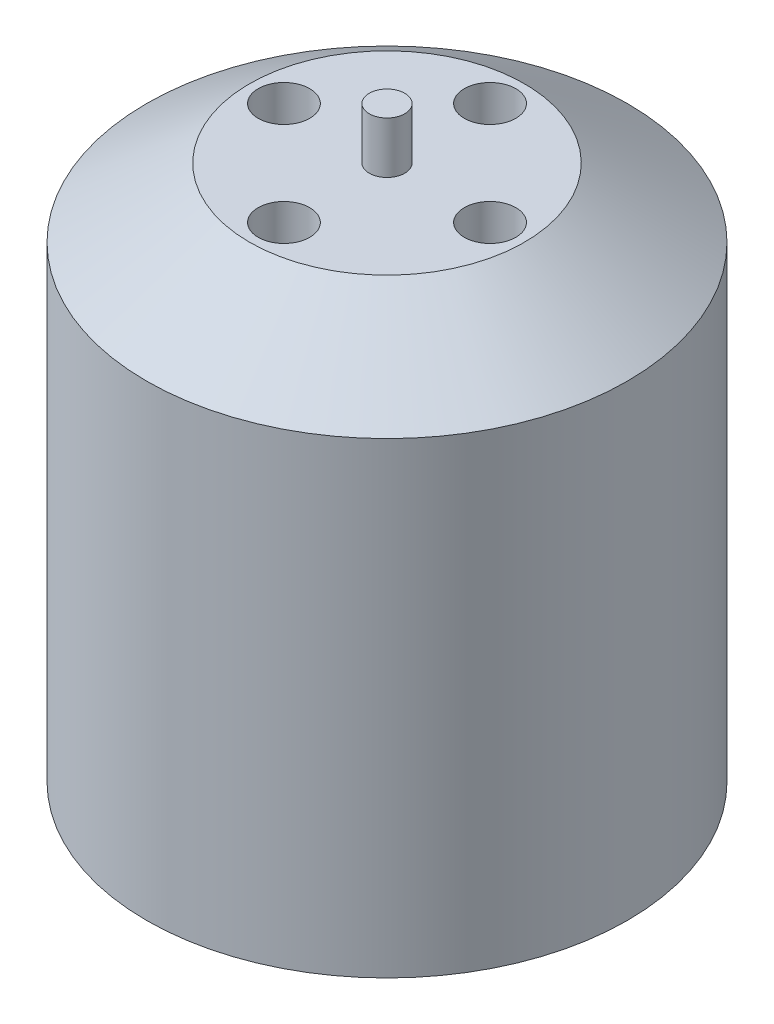
ISO-10303-21;
HEADER;
FILE_DESCRIPTION(('STEP AP214'),'2;1');
FILE_NAME('part.step','',(''),(''),'','','');
FILE_SCHEMA(('AUTOMOTIVE_DESIGN { 1 0 10303 214 1 1 1 1 }'));
ENDSEC;
DATA;
#1=APPLICATION_CONTEXT('core data for automotive mechanical design processes');
#2=APPLICATION_PROTOCOL_DEFINITION('international standard','automotive_design',2000,#1);
#3=PRODUCT_CONTEXT('',#1,'mechanical');
#4=PRODUCT('Part','Part','',(#3));
#5=PRODUCT_RELATED_PRODUCT_CATEGORY('part','',(#4));
#6=PRODUCT_DEFINITION_FORMATION('','',#4);
#7=PRODUCT_DEFINITION_CONTEXT('part definition',#1,'design');
#8=PRODUCT_DEFINITION('design','',#6,#7);
#9=PRODUCT_DEFINITION_SHAPE('','',#8);
#10=(LENGTH_UNIT() NAMED_UNIT(*) SI_UNIT(.MILLI.,.METRE.));
#11=(NAMED_UNIT(*) PLANE_ANGLE_UNIT() SI_UNIT($,.RADIAN.));
#12=(NAMED_UNIT(*) SI_UNIT($,.STERADIAN.) SOLID_ANGLE_UNIT());
#13=UNCERTAINTY_MEASURE_WITH_UNIT(LENGTH_MEASURE(1.E-05),#10,'distance_accuracy_value','');
#14=(GEOMETRIC_REPRESENTATION_CONTEXT(3) GLOBAL_UNCERTAINTY_ASSIGNED_CONTEXT((#13)) GLOBAL_UNIT_ASSIGNED_CONTEXT((#10,
#11,#12)) REPRESENTATION_CONTEXT('',''));
#15=CARTESIAN_POINT('',(0.,0.,0.));
#16=DIRECTION('',(0.,0.,1.));
#17=DIRECTION('',(1.,0.,0.));
#18=AXIS2_PLACEMENT_3D('',#15,#16,#17);
#19=CARTESIAN_POINT('',(0.,31.2,0.));
#20=DIRECTION('',(0.,-1.,0.));
#21=DIRECTION('',(0.,0.,-1.));
#22=AXIS2_PLACEMENT_3D('',#19,#20,#21);
#23=CYLINDRICAL_SURFACE('',#22,14.);
#24=CARTESIAN_POINT('',(0.,27.2,0.));
#25=DIRECTION('',(0.,1.,0.));
#26=DIRECTION('',(0.,0.,1.));
#27=AXIS2_PLACEMENT_3D('',#24,#25,#26);
#28=CIRCLE('',#27,14.);
#29=CARTESIAN_POINT('',(0.,27.2,14.));
#30=VERTEX_POINT('',#29);
#31=EDGE_CURVE('E46',#30,#30,#28,.F.);
#32=ORIENTED_EDGE('',*,*,#31,.T.);
#33=EDGE_LOOP('',(#32));
#34=FACE_BOUND('',#33,.T.);
#35=CARTESIAN_POINT('',(0.,0.,0.));
#36=DIRECTION('',(0.,1.,0.));
#37=DIRECTION('',(0.,0.,1.));
#38=AXIS2_PLACEMENT_3D('',#35,#36,#37);
#39=CIRCLE('',#38,14.);
#40=CARTESIAN_POINT('',(0.,0.,14.));
#41=VERTEX_POINT('',#40);
#42=EDGE_CURVE('E87',#41,#41,#39,.T.);
#43=ORIENTED_EDGE('',*,*,#42,.T.);
#44=EDGE_LOOP('',(#43));
#45=FACE_BOUND('',#44,.T.);
#46=ADVANCED_FACE('F41',(#34,#45),#23,.T.);
#47=CARTESIAN_POINT('',(0.,31.2,0.));
#48=DIRECTION('',(0.,1.,0.));
#49=DIRECTION('',(0.,0.,1.));
#50=AXIS2_PLACEMENT_3D('',#47,#48,#49);
#51=PLANE('',#50);
#52=CARTESIAN_POINT('',(-6.,31.2,0.));
#53=DIRECTION('',(0.,1.,0.));
#54=DIRECTION('',(0.,0.,1.));
#55=AXIS2_PLACEMENT_3D('',#52,#53,#54);
#56=CIRCLE('',#55,1.5);
#57=CARTESIAN_POINT('',(-6.,31.2,1.5));
#58=VERTEX_POINT('',#57);
#59=EDGE_CURVE('E63',#58,#58,#56,.T.);
#60=ORIENTED_EDGE('',*,*,#59,.F.);
#61=EDGE_LOOP('',(#60));
#62=FACE_BOUND('',#61,.T.);
#63=CARTESIAN_POINT('',(0.,31.2,6.));
#64=DIRECTION('',(0.,1.,0.));
#65=DIRECTION('',(0.,0.,1.));
#66=AXIS2_PLACEMENT_3D('',#63,#64,#65);
#67=CIRCLE('',#66,1.5);
#68=CARTESIAN_POINT('',(0.,31.2,7.5));
#69=VERTEX_POINT('',#68);
#70=EDGE_CURVE('E69',#69,#69,#67,.T.);
#71=ORIENTED_EDGE('',*,*,#70,.F.);
#72=EDGE_LOOP('',(#71));
#73=FACE_BOUND('',#72,.T.);
#74=CARTESIAN_POINT('',(6.,31.2,0.));
#75=DIRECTION('',(0.,1.,0.));
#76=DIRECTION('',(0.,0.,1.));
#77=AXIS2_PLACEMENT_3D('',#74,#75,#76);
#78=CIRCLE('',#77,1.5);
#79=CARTESIAN_POINT('',(6.,31.2,1.5));
#80=VERTEX_POINT('',#79);
#81=EDGE_CURVE('E75',#80,#80,#78,.T.);
#82=ORIENTED_EDGE('',*,*,#81,.F.);
#83=EDGE_LOOP('',(#82));
#84=FACE_BOUND('',#83,.T.);
#85=CARTESIAN_POINT('',(0.,31.2,-6.));
#86=DIRECTION('',(0.,1.,0.));
#87=DIRECTION('',(0.,0.,1.));
#88=AXIS2_PLACEMENT_3D('',#85,#86,#87);
#89=CIRCLE('',#88,1.5);
#90=CARTESIAN_POINT('',(0.,31.2,-4.5));
#91=VERTEX_POINT('',#90);
#92=EDGE_CURVE('E81',#91,#91,#89,.T.);
#93=ORIENTED_EDGE('',*,*,#92,.F.);
#94=EDGE_LOOP('',(#93));
#95=FACE_BOUND('',#94,.T.);
#96=CARTESIAN_POINT('',(0.,31.2,0.));
#97=DIRECTION('',(0.,1.,0.));
#98=DIRECTION('',(0.,0.,1.));
#99=AXIS2_PLACEMENT_3D('',#96,#97,#98);
#100=CIRCLE('',#99,1.03373165532951);
#101=CARTESIAN_POINT('',(0.,31.2,1.03373165532951));
#102=VERTEX_POINT('',#101);
#103=EDGE_CURVE('E62',#102,#102,#100,.T.);
#104=ORIENTED_EDGE('',*,*,#103,.F.);
#105=EDGE_LOOP('',(#104));
#106=FACE_BOUND('',#105,.T.);
#107=CARTESIAN_POINT('',(0.,31.2,0.));
#108=DIRECTION('',(0.,1.,0.));
#109=DIRECTION('',(0.,0.,1.));
#110=AXIS2_PLACEMENT_3D('',#107,#108,#109);
#111=CIRCLE('',#110,7.99999999999996);
#112=CARTESIAN_POINT('',(0.,31.2,7.99999999999996));
#113=VERTEX_POINT('',#112);
#114=EDGE_CURVE('E54',#113,#113,#111,.T.);
#115=ORIENTED_EDGE('',*,*,#114,.T.);
#116=EDGE_LOOP('',(#115));
#117=FACE_BOUND('',#116,.T.);
#118=ADVANCED_FACE('F94',(#62,#73,#84,#95,#106,#117),#51,.T.);
#119=CARTESIAN_POINT('',(0.,0.,0.));
#120=DIRECTION('',(0.,1.,0.));
#121=DIRECTION('',(0.,0.,1.));
#122=AXIS2_PLACEMENT_3D('',#119,#120,#121);
#123=PLANE('',#122);
#124=CARTESIAN_POINT('',(0.,0.,8.));
#125=DIRECTION('',(0.,-1.,0.));
#126=DIRECTION('',(0.,0.,-1.));
#127=AXIS2_PLACEMENT_3D('',#124,#125,#126);
#128=CIRCLE('',#127,1.5);
#129=CARTESIAN_POINT('',(0.,0.,6.5));
#130=VERTEX_POINT('',#129);
#131=EDGE_CURVE('E198',#130,#130,#128,.T.);
#132=ORIENTED_EDGE('',*,*,#131,.F.);
#133=EDGE_LOOP('',(#132));
#134=FACE_BOUND('',#133,.T.);
#135=CARTESIAN_POINT('',(-9.5,0.,0.));
#136=DIRECTION('',(0.,-1.,0.));
#137=DIRECTION('',(0.,0.,-1.));
#138=AXIS2_PLACEMENT_3D('',#135,#136,#137);
#139=CIRCLE('',#138,1.5);
#140=CARTESIAN_POINT('',(-9.5,0.,-1.5));
#141=VERTEX_POINT('',#140);
#142=EDGE_CURVE('E202',#141,#141,#139,.T.);
#143=ORIENTED_EDGE('',*,*,#142,.F.);
#144=EDGE_LOOP('',(#143));
#145=FACE_BOUND('',#144,.T.);
#146=CARTESIAN_POINT('',(9.5,0.,0.));
#147=DIRECTION('',(0.,-1.,0.));
#148=DIRECTION('',(0.,0.,-1.));
#149=AXIS2_PLACEMENT_3D('',#146,#147,#148);
#150=CIRCLE('',#149,1.5);
#151=CARTESIAN_POINT('',(9.5,0.,-1.5));
#152=VERTEX_POINT('',#151);
#153=EDGE_CURVE('E210',#152,#152,#150,.T.);
#154=ORIENTED_EDGE('',*,*,#153,.F.);
#155=EDGE_LOOP('',(#154));
#156=FACE_BOUND('',#155,.T.);
#157=CARTESIAN_POINT('',(0.,0.,-8.));
#158=DIRECTION('',(0.,-1.,0.));
#159=DIRECTION('',(0.,0.,-1.));
#160=AXIS2_PLACEMENT_3D('',#157,#158,#159);
#161=CIRCLE('',#160,1.5);
#162=CARTESIAN_POINT('',(0.,0.,-9.5));
#163=VERTEX_POINT('',#162);
#164=EDGE_CURVE('E216',#163,#163,#161,.T.);
#165=ORIENTED_EDGE('',*,*,#164,.F.);
#166=EDGE_LOOP('',(#165));
#167=FACE_BOUND('',#166,.T.);
#168=CARTESIAN_POINT('',(0.,0.,0.));
#169=DIRECTION('',(0.,-1.,0.));
#170=DIRECTION('',(0.,0.,-1.));
#171=AXIS2_PLACEMENT_3D('',#168,#169,#170);
#172=CIRCLE('',#171,3.1);
#173=CARTESIAN_POINT('',(0.,0.,-3.1));
#174=VERTEX_POINT('',#173);
#175=EDGE_CURVE('E10',#174,#174,#172,.T.);
#176=ORIENTED_EDGE('',*,*,#175,.F.);
#177=EDGE_LOOP('',(#176));
#178=FACE_BOUND('',#177,.T.);
#179=ORIENTED_EDGE('',*,*,#42,.F.);
#180=EDGE_LOOP('',(#179));
#181=FACE_BOUND('',#180,.T.);
#182=ADVANCED_FACE('F98',(#134,#145,#156,#167,#178,#181),#123,.F.);
#183=CARTESIAN_POINT('',(0.,31.2,0.));
#184=DIRECTION('',(0.,-1.,0.));
#185=DIRECTION('',(0.,0.,-1.));
#186=AXIS2_PLACEMENT_3D('',#183,#184,#185);
#187=CONICAL_SURFACE('',#186,7.99999999999996,0.98279372324733);
#188=ORIENTED_EDGE('',*,*,#31,.F.);
#189=EDGE_LOOP('',(#188));
#190=FACE_BOUND('',#189,.T.);
#191=ORIENTED_EDGE('',*,*,#114,.F.);
#192=EDGE_LOOP('',(#191));
#193=FACE_BOUND('',#192,.T.);
#194=ADVANCED_FACE('F44',(#190,#193),#187,.T.);
#195=CARTESIAN_POINT('',(0.,34.2,0.));
#196=DIRECTION('',(0.,-1.,0.));
#197=DIRECTION('',(0.,0.,-1.));
#198=AXIS2_PLACEMENT_3D('',#195,#196,#197);
#199=CYLINDRICAL_SURFACE('',#198,1.03373165532951);
#200=CARTESIAN_POINT('',(0.,34.2,0.));
#201=DIRECTION('',(0.,1.,0.));
#202=DIRECTION('',(0.,0.,1.));
#203=AXIS2_PLACEMENT_3D('',#200,#201,#202);
#204=CIRCLE('',#203,1.03373165532951);
#205=CARTESIAN_POINT('',(0.,34.2,1.03373165532951));
#206=VERTEX_POINT('',#205);
#207=EDGE_CURVE('E84',#206,#206,#204,.T.);
#208=ORIENTED_EDGE('',*,*,#207,.F.);
#209=EDGE_LOOP('',(#208));
#210=FACE_BOUND('',#209,.T.);
#211=ORIENTED_EDGE('',*,*,#103,.T.);
#212=EDGE_LOOP('',(#211));
#213=FACE_BOUND('',#212,.T.);
#214=ADVANCED_FACE('F97',(#210,#213),#199,.T.);
#215=CARTESIAN_POINT('',(0.,34.2,0.));
#216=DIRECTION('',(0.,1.,0.));
#217=DIRECTION('',(0.,0.,1.));
#218=AXIS2_PLACEMENT_3D('',#215,#216,#217);
#219=PLANE('',#218);
#220=ORIENTED_EDGE('',*,*,#207,.T.);
#221=EDGE_LOOP('',(#220));
#222=FACE_BOUND('',#221,.T.);
#223=ADVANCED_FACE('F104',(#222),#219,.T.);
#224=CARTESIAN_POINT('',(0.,28.2,-6.));
#225=DIRECTION('',(0.,1.,0.));
#226=DIRECTION('',(0.,0.,1.));
#227=AXIS2_PLACEMENT_3D('',#224,#225,#226);
#228=CYLINDRICAL_SURFACE('',#227,1.5);
#229=CARTESIAN_POINT('',(0.,28.2,-6.));
#230=DIRECTION('',(0.,1.,0.));
#231=DIRECTION('',(0.,0.,1.));
#232=AXIS2_PLACEMENT_3D('',#229,#230,#231);
#233=CIRCLE('',#232,1.5);
#234=CARTESIAN_POINT('',(0.,28.2,-4.5));
#235=VERTEX_POINT('',#234);
#236=EDGE_CURVE('E78',#235,#235,#233,.T.);
#237=ORIENTED_EDGE('',*,*,#236,.F.);
#238=EDGE_LOOP('',(#237));
#239=FACE_BOUND('',#238,.T.);
#240=ORIENTED_EDGE('',*,*,#92,.T.);
#241=EDGE_LOOP('',(#240));
#242=FACE_BOUND('',#241,.T.);
#243=ADVANCED_FACE('F121',(#239,#242),#228,.F.);
#244=CARTESIAN_POINT('',(0.,28.2,0.));
#245=DIRECTION('',(0.,1.,0.));
#246=DIRECTION('',(0.,0.,1.));
#247=AXIS2_PLACEMENT_3D('',#244,#245,#246);
#248=PLANE('',#247);
#249=ORIENTED_EDGE('',*,*,#236,.T.);
#250=EDGE_LOOP('',(#249));
#251=FACE_BOUND('',#250,.T.);
#252=ADVANCED_FACE('F125',(#251),#248,.T.);
#253=CARTESIAN_POINT('',(6.,28.2,0.));
#254=DIRECTION('',(0.,1.,0.));
#255=DIRECTION('',(0.,0.,1.));
#256=AXIS2_PLACEMENT_3D('',#253,#254,#255);
#257=CYLINDRICAL_SURFACE('',#256,1.5);
#258=CARTESIAN_POINT('',(6.,28.2,0.));
#259=DIRECTION('',(0.,1.,0.));
#260=DIRECTION('',(0.,0.,1.));
#261=AXIS2_PLACEMENT_3D('',#258,#259,#260);
#262=CIRCLE('',#261,1.5);
#263=CARTESIAN_POINT('',(6.,28.2,1.5));
#264=VERTEX_POINT('',#263);
#265=EDGE_CURVE('E72',#264,#264,#262,.T.);
#266=ORIENTED_EDGE('',*,*,#265,.F.);
#267=EDGE_LOOP('',(#266));
#268=FACE_BOUND('',#267,.T.);
#269=ORIENTED_EDGE('',*,*,#81,.T.);
#270=EDGE_LOOP('',(#269));
#271=FACE_BOUND('',#270,.T.);
#272=ADVANCED_FACE('F129',(#268,#271),#257,.F.);
#273=CARTESIAN_POINT('',(0.,28.2,0.));
#274=DIRECTION('',(0.,1.,0.));
#275=DIRECTION('',(0.,0.,1.));
#276=AXIS2_PLACEMENT_3D('',#273,#274,#275);
#277=PLANE('',#276);
#278=ORIENTED_EDGE('',*,*,#265,.T.);
#279=EDGE_LOOP('',(#278));
#280=FACE_BOUND('',#279,.T.);
#281=ADVANCED_FACE('F133',(#280),#277,.T.);
#282=CARTESIAN_POINT('',(0.,28.2,6.));
#283=DIRECTION('',(0.,1.,0.));
#284=DIRECTION('',(0.,0.,1.));
#285=AXIS2_PLACEMENT_3D('',#282,#283,#284);
#286=CYLINDRICAL_SURFACE('',#285,1.5);
#287=CARTESIAN_POINT('',(0.,28.2,6.));
#288=DIRECTION('',(0.,1.,0.));
#289=DIRECTION('',(0.,0.,1.));
#290=AXIS2_PLACEMENT_3D('',#287,#288,#289);
#291=CIRCLE('',#290,1.5);
#292=CARTESIAN_POINT('',(0.,28.2,7.5));
#293=VERTEX_POINT('',#292);
#294=EDGE_CURVE('E66',#293,#293,#291,.T.);
#295=ORIENTED_EDGE('',*,*,#294,.F.);
#296=EDGE_LOOP('',(#295));
#297=FACE_BOUND('',#296,.T.);
#298=ORIENTED_EDGE('',*,*,#70,.T.);
#299=EDGE_LOOP('',(#298));
#300=FACE_BOUND('',#299,.T.);
#301=ADVANCED_FACE('F137',(#297,#300),#286,.F.);
#302=CARTESIAN_POINT('',(0.,28.2,0.));
#303=DIRECTION('',(0.,1.,0.));
#304=DIRECTION('',(0.,0.,1.));
#305=AXIS2_PLACEMENT_3D('',#302,#303,#304);
#306=PLANE('',#305);
#307=ORIENTED_EDGE('',*,*,#294,.T.);
#308=EDGE_LOOP('',(#307));
#309=FACE_BOUND('',#308,.T.);
#310=ADVANCED_FACE('F141',(#309),#306,.T.);
#311=CARTESIAN_POINT('',(-6.,28.2,0.));
#312=DIRECTION('',(0.,1.,0.));
#313=DIRECTION('',(0.,0.,1.));
#314=AXIS2_PLACEMENT_3D('',#311,#312,#313);
#315=CYLINDRICAL_SURFACE('',#314,1.5);
#316=CARTESIAN_POINT('',(-6.,28.2,0.));
#317=DIRECTION('',(0.,1.,0.));
#318=DIRECTION('',(0.,0.,1.));
#319=AXIS2_PLACEMENT_3D('',#316,#317,#318);
#320=CIRCLE('',#319,1.5);
#321=CARTESIAN_POINT('',(-6.,28.2,1.5));
#322=VERTEX_POINT('',#321);
#323=EDGE_CURVE('E59',#322,#322,#320,.T.);
#324=ORIENTED_EDGE('',*,*,#323,.F.);
#325=EDGE_LOOP('',(#324));
#326=FACE_BOUND('',#325,.T.);
#327=ORIENTED_EDGE('',*,*,#59,.T.);
#328=EDGE_LOOP('',(#327));
#329=FACE_BOUND('',#328,.T.);
#330=ADVANCED_FACE('F145',(#326,#329),#315,.F.);
#331=CARTESIAN_POINT('',(0.,28.2,0.));
#332=DIRECTION('',(0.,1.,0.));
#333=DIRECTION('',(0.,0.,1.));
#334=AXIS2_PLACEMENT_3D('',#331,#332,#333);
#335=PLANE('',#334);
#336=ORIENTED_EDGE('',*,*,#323,.T.);
#337=EDGE_LOOP('',(#336));
#338=FACE_BOUND('',#337,.T.);
#339=ADVANCED_FACE('F149',(#338),#335,.T.);
#340=CARTESIAN_POINT('',(0.,-3.,0.));
#341=DIRECTION('',(0.,1.,0.));
#342=DIRECTION('',(0.,0.,1.));
#343=AXIS2_PLACEMENT_3D('',#340,#341,#342);
#344=CYLINDRICAL_SURFACE('',#343,3.1);
#345=CARTESIAN_POINT('',(0.,-3.,0.));
#346=DIRECTION('',(0.,-1.,0.));
#347=DIRECTION('',(0.,0.,-1.));
#348=AXIS2_PLACEMENT_3D('',#345,#346,#347);
#349=CIRCLE('',#348,3.1);
#350=CARTESIAN_POINT('',(0.,-3.,-3.1));
#351=VERTEX_POINT('',#350);
#352=EDGE_CURVE('E57',#351,#351,#349,.T.);
#353=ORIENTED_EDGE('',*,*,#352,.F.);
#354=EDGE_LOOP('',(#353));
#355=FACE_BOUND('',#354,.T.);
#356=ORIENTED_EDGE('',*,*,#175,.T.);
#357=EDGE_LOOP('',(#356));
#358=FACE_BOUND('',#357,.T.);
#359=ADVANCED_FACE('F153',(#355,#358),#344,.T.);
#360=CARTESIAN_POINT('',(0.,-3.,0.));
#361=DIRECTION('',(0.,-1.,0.));
#362=DIRECTION('',(0.,0.,-1.));
#363=AXIS2_PLACEMENT_3D('',#360,#361,#362);
#364=PLANE('',#363);
#365=ORIENTED_EDGE('',*,*,#352,.T.);
#366=EDGE_LOOP('',(#365));
#367=FACE_BOUND('',#366,.T.);
#368=ADVANCED_FACE('F157',(#367),#364,.T.);
#369=CARTESIAN_POINT('',(0.,3.,-8.));
#370=DIRECTION('',(0.,-1.,0.));
#371=DIRECTION('',(0.,0.,-1.));
#372=AXIS2_PLACEMENT_3D('',#369,#370,#371);
#373=CYLINDRICAL_SURFACE('',#372,1.5);
#374=CARTESIAN_POINT('',(0.,3.,-8.));
#375=DIRECTION('',(0.,-1.,0.));
#376=DIRECTION('',(0.,0.,-1.));
#377=AXIS2_PLACEMENT_3D('',#374,#375,#376);
#378=CIRCLE('',#377,1.5);
#379=CARTESIAN_POINT('',(0.,3.,-9.5));
#380=VERTEX_POINT('',#379);
#381=EDGE_CURVE('E218',#380,#380,#378,.T.);
#382=ORIENTED_EDGE('',*,*,#381,.F.);
#383=EDGE_LOOP('',(#382));
#384=FACE_BOUND('',#383,.T.);
#385=ORIENTED_EDGE('',*,*,#164,.T.);
#386=EDGE_LOOP('',(#385));
#387=FACE_BOUND('',#386,.T.);
#388=ADVANCED_FACE('F161',(#384,#387),#373,.F.);
#389=CARTESIAN_POINT('',(0.,3.,-8.));
#390=DIRECTION('',(0.,-1.,0.));
#391=DIRECTION('',(0.,0.,-1.));
#392=AXIS2_PLACEMENT_3D('',#389,#390,#391);
#393=PLANE('',#392);
#394=ORIENTED_EDGE('',*,*,#381,.T.);
#395=EDGE_LOOP('',(#394));
#396=FACE_BOUND('',#395,.T.);
#397=ADVANCED_FACE('F163',(#396),#393,.T.);
#398=CARTESIAN_POINT('',(9.5,3.,0.));
#399=DIRECTION('',(0.,-1.,0.));
#400=DIRECTION('',(0.,0.,-1.));
#401=AXIS2_PLACEMENT_3D('',#398,#399,#400);
#402=CYLINDRICAL_SURFACE('',#401,1.5);
#403=CARTESIAN_POINT('',(9.5,3.,0.));
#404=DIRECTION('',(0.,-1.,0.));
#405=DIRECTION('',(0.,0.,-1.));
#406=AXIS2_PLACEMENT_3D('',#403,#404,#405);
#407=CIRCLE('',#406,1.5);
#408=CARTESIAN_POINT('',(9.5,3.,-1.5));
#409=VERTEX_POINT('',#408);
#410=EDGE_CURVE('E213',#409,#409,#407,.T.);
#411=ORIENTED_EDGE('',*,*,#410,.F.);
#412=EDGE_LOOP('',(#411));
#413=FACE_BOUND('',#412,.T.);
#414=ORIENTED_EDGE('',*,*,#153,.T.);
#415=EDGE_LOOP('',(#414));
#416=FACE_BOUND('',#415,.T.);
#417=ADVANCED_FACE('F166',(#413,#416),#402,.F.);
#418=CARTESIAN_POINT('',(9.5,3.,0.));
#419=DIRECTION('',(0.,-1.,0.));
#420=DIRECTION('',(0.,0.,-1.));
#421=AXIS2_PLACEMENT_3D('',#418,#419,#420);
#422=PLANE('',#421);
#423=ORIENTED_EDGE('',*,*,#410,.T.);
#424=EDGE_LOOP('',(#423));
#425=FACE_BOUND('',#424,.T.);
#426=ADVANCED_FACE('F171',(#425),#422,.T.);
#427=CARTESIAN_POINT('',(-9.5,3.,0.));
#428=DIRECTION('',(0.,-1.,0.));
#429=DIRECTION('',(0.,0.,-1.));
#430=AXIS2_PLACEMENT_3D('',#427,#428,#429);
#431=CYLINDRICAL_SURFACE('',#430,1.5);
#432=CARTESIAN_POINT('',(-9.5,3.,0.));
#433=DIRECTION('',(0.,-1.,0.));
#434=DIRECTION('',(0.,0.,-1.));
#435=AXIS2_PLACEMENT_3D('',#432,#433,#434);
#436=CIRCLE('',#435,1.5);
#437=CARTESIAN_POINT('',(-9.5,3.,-1.5));
#438=VERTEX_POINT('',#437);
#439=EDGE_CURVE('E207',#438,#438,#436,.T.);
#440=ORIENTED_EDGE('',*,*,#439,.F.);
#441=EDGE_LOOP('',(#440));
#442=FACE_BOUND('',#441,.T.);
#443=ORIENTED_EDGE('',*,*,#142,.T.);
#444=EDGE_LOOP('',(#443));
#445=FACE_BOUND('',#444,.T.);
#446=ADVANCED_FACE('F174',(#442,#445),#431,.F.);
#447=CARTESIAN_POINT('',(-9.5,3.,0.));
#448=DIRECTION('',(0.,-1.,0.));
#449=DIRECTION('',(0.,0.,-1.));
#450=AXIS2_PLACEMENT_3D('',#447,#448,#449);
#451=PLANE('',#450);
#452=ORIENTED_EDGE('',*,*,#439,.T.);
#453=EDGE_LOOP('',(#452));
#454=FACE_BOUND('',#453,.T.);
#455=ADVANCED_FACE('F179',(#454),#451,.T.);
#456=CARTESIAN_POINT('',(0.,3.,8.));
#457=DIRECTION('',(0.,-1.,0.));
#458=DIRECTION('',(0.,0.,-1.));
#459=AXIS2_PLACEMENT_3D('',#456,#457,#458);
#460=CYLINDRICAL_SURFACE('',#459,1.5);
#461=CARTESIAN_POINT('',(0.,3.,8.));
#462=DIRECTION('',(0.,-1.,0.));
#463=DIRECTION('',(0.,0.,-1.));
#464=AXIS2_PLACEMENT_3D('',#461,#462,#463);
#465=CIRCLE('',#464,1.5);
#466=CARTESIAN_POINT('',(0.,3.,6.5));
#467=VERTEX_POINT('',#466);
#468=EDGE_CURVE('E197',#467,#467,#465,.T.);
#469=ORIENTED_EDGE('',*,*,#468,.F.);
#470=EDGE_LOOP('',(#469));
#471=FACE_BOUND('',#470,.T.);
#472=ORIENTED_EDGE('',*,*,#131,.T.);
#473=EDGE_LOOP('',(#472));
#474=FACE_BOUND('',#473,.T.);
#475=ADVANCED_FACE('F182',(#471,#474),#460,.F.);
#476=CARTESIAN_POINT('',(0.,3.,8.));
#477=DIRECTION('',(0.,-1.,0.));
#478=DIRECTION('',(0.,0.,-1.));
#479=AXIS2_PLACEMENT_3D('',#476,#477,#478);
#480=PLANE('',#479);
#481=ORIENTED_EDGE('',*,*,#468,.T.);
#482=EDGE_LOOP('',(#481));
#483=FACE_BOUND('',#482,.T.);
#484=ADVANCED_FACE('F189',(#483),#480,.T.);
#485=CLOSED_SHELL('',(#46,#118,#182,#194,#214,#223,#243,#252,#272,#281,#301,#310,#330,#339,#359,
#368,#388,#397,#417,#426,#446,#455,#475,#484));
#486=MANIFOLD_SOLID_BREP('B2',#485);
#487=ADVANCED_BREP_SHAPE_REPRESENTATION('',(#18,#486),#14);
#488=SHAPE_DEFINITION_REPRESENTATION(#9,#487);
ENDSEC;
END-ISO-10303-21;
